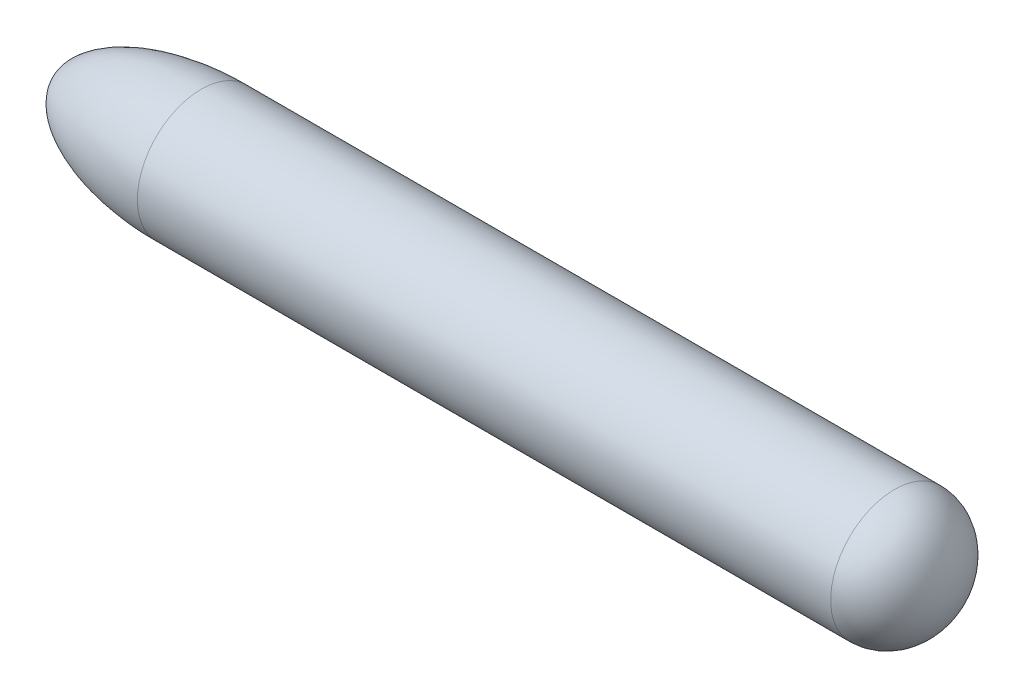
ISO-10303-21;
HEADER;
FILE_DESCRIPTION(('STEP AP214'),'2;1');
FILE_NAME('part.step','',(''),(''),'','','');
FILE_SCHEMA(('AUTOMOTIVE_DESIGN { 1 0 10303 214 1 1 1 1 }'));
ENDSEC;
DATA;
#1=APPLICATION_CONTEXT('core data for automotive mechanical design processes');
#2=APPLICATION_PROTOCOL_DEFINITION('international standard','automotive_design',2000,#1);
#3=PRODUCT_CONTEXT('',#1,'mechanical');
#4=PRODUCT('Part','Part','',(#3));
#5=PRODUCT_RELATED_PRODUCT_CATEGORY('part','',(#4));
#6=PRODUCT_DEFINITION_FORMATION('','',#4);
#7=PRODUCT_DEFINITION_CONTEXT('part definition',#1,'design');
#8=PRODUCT_DEFINITION('design','',#6,#7);
#9=PRODUCT_DEFINITION_SHAPE('','',#8);
#10=(LENGTH_UNIT() NAMED_UNIT(*) SI_UNIT(.MILLI.,.METRE.));
#11=(NAMED_UNIT(*) PLANE_ANGLE_UNIT() SI_UNIT($,.RADIAN.));
#12=(NAMED_UNIT(*) SI_UNIT($,.STERADIAN.) SOLID_ANGLE_UNIT());
#13=UNCERTAINTY_MEASURE_WITH_UNIT(LENGTH_MEASURE(1.E-05),#10,'distance_accuracy_value','');
#14=(GEOMETRIC_REPRESENTATION_CONTEXT(3) GLOBAL_UNCERTAINTY_ASSIGNED_CONTEXT((#13)) GLOBAL_UNIT_ASSIGNED_CONTEXT((#10,
#11,#12)) REPRESENTATION_CONTEXT('',''));
#15=CARTESIAN_POINT('',(0.,0.,0.));
#16=DIRECTION('',(0.,0.,1.));
#17=DIRECTION('',(1.,0.,0.));
#18=AXIS2_PLACEMENT_3D('',#15,#16,#17);
#19=CARTESIAN_POINT('',(761.29,0.,0.));
#20=DIRECTION('',(-1.,0.,0.));
#21=DIRECTION('',(0.,0.,1.));
#22=AXIS2_PLACEMENT_3D('',#19,#20,#21);
#23=CYLINDRICAL_SURFACE('',#22,115.);
#24=CARTESIAN_POINT('',(761.29,0.,0.));
#25=DIRECTION('',(1.,0.,0.));
#26=DIRECTION('',(0.,0.,-1.));
#27=AXIS2_PLACEMENT_3D('',#24,#25,#26);
#28=CIRCLE('',#27,115.);
#29=CARTESIAN_POINT('',(761.29,0.,-115.));
#30=VERTEX_POINT('',#29);
#31=EDGE_CURVE('E11',#30,#30,#28,.T.);
#32=ORIENTED_EDGE('',*,*,#31,.F.);
#33=EDGE_LOOP('',(#32));
#34=FACE_BOUND('',#33,.T.);
#35=CARTESIAN_POINT('',(-487.1,0.,0.));
#36=DIRECTION('',(1.,0.,0.));
#37=DIRECTION('',(0.,0.,-1.));
#38=AXIS2_PLACEMENT_3D('',#35,#36,#37);
#39=CIRCLE('',#38,115.);
#40=CARTESIAN_POINT('',(-487.1,0.,-115.));
#41=VERTEX_POINT('',#40);
#42=EDGE_CURVE('E43',#41,#41,#39,.T.);
#43=ORIENTED_EDGE('',*,*,#42,.T.);
#44=EDGE_LOOP('',(#43));
#45=FACE_BOUND('',#44,.T.);
#46=ADVANCED_FACE('F36',(#34,#45),#23,.T.);
#47=CARTESIAN_POINT('',(761.29,0.,0.));
#48=DIRECTION('',(0.,1.,0.));
#49=DIRECTION('',(0.,0.,-1.));
#50=AXIS2_PLACEMENT_3D('',#47,#48,#49);
#51=ELLIPSE('',#50,115.,96.77);
#52=TRIMMED_CURVE('',#51,(PARAMETER_VALUE(4.71238898038469)),
(PARAMETER_VALUE(7.85398163397448)),.T.,.PARAMETER.);
#53=CARTESIAN_POINT('',(761.29,0.,0.));
#54=DIRECTION('',(-1.,0.,0.));
#55=AXIS1_PLACEMENT('',#53,#54);
#56=SURFACE_OF_REVOLUTION('',#52,#55);
#57=ORIENTED_EDGE('',*,*,#31,.T.);
#58=EDGE_LOOP('',(#57));
#59=FACE_BOUND('',#58,.T.);
#60=CARTESIAN_POINT('',(858.06,0.,0.));
#61=VERTEX_POINT('',#60);
#62=VERTEX_LOOP('',#61);
#63=FACE_BOUND('',#62,.T.);
#64=ADVANCED_FACE('F51',(#59,#63),#56,.T.);
#65=CARTESIAN_POINT('',(-487.1,0.,0.));
#66=DIRECTION('',(0.,1.,0.));
#67=DIRECTION('',(-1.,0.,0.));
#68=AXIS2_PLACEMENT_3D('',#65,#66,#67);
#69=ELLIPSE('',#68,254.84,115.);
#70=TRIMMED_CURVE('',#69,(PARAMETER_VALUE(0.)),(PARAMETER_VALUE(3.14159265358979)),.T.,.PARAMETER.);
#71=CARTESIAN_POINT('',(858.06,0.,-4.0152035396696E-13));
#72=DIRECTION('',(1.,0.,0.));
#73=AXIS1_PLACEMENT('',#71,#72);
#74=SURFACE_OF_REVOLUTION('',#70,#73);
#75=ORIENTED_EDGE('',*,*,#42,.F.);
#76=EDGE_LOOP('',(#75));
#77=FACE_BOUND('',#76,.T.);
#78=CARTESIAN_POINT('',(-741.94,0.,2.0235488319792E-13));
#79=VERTEX_POINT('',#78);
#80=VERTEX_LOOP('',#79);
#81=FACE_BOUND('',#80,.T.);
#82=ADVANCED_FACE('F49',(#77,#81),#74,.T.);
#83=CLOSED_SHELL('',(#46,#64,#82));
#84=MANIFOLD_SOLID_BREP('B2',#83);
#85=ADVANCED_BREP_SHAPE_REPRESENTATION('',(#18,#84),#14);
#86=SHAPE_DEFINITION_REPRESENTATION(#9,#85);
ENDSEC;
END-ISO-10303-21;
